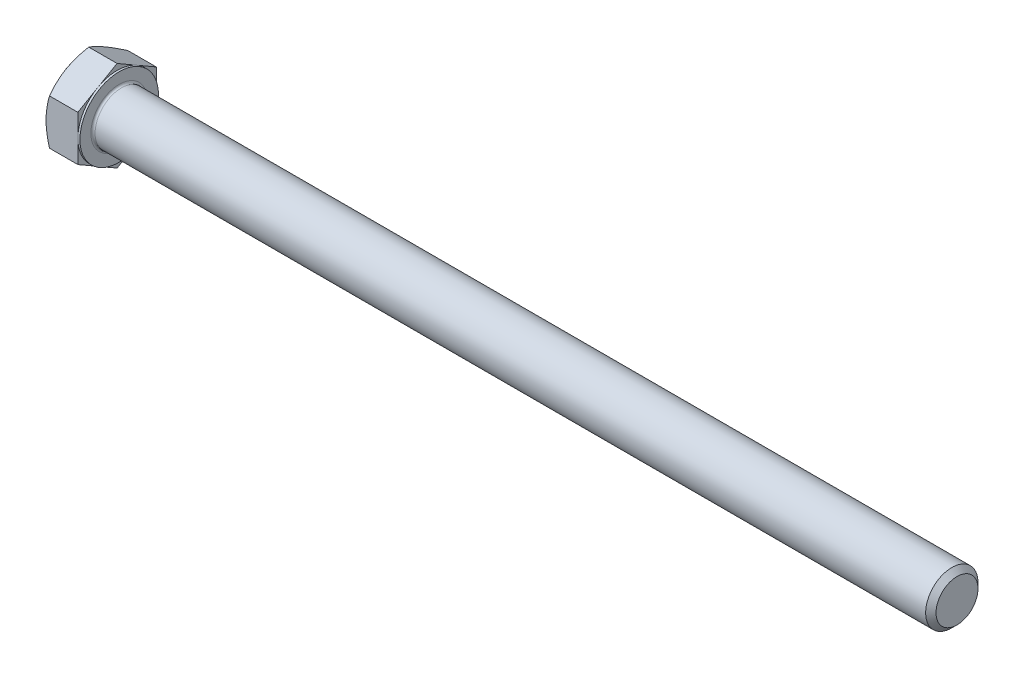
ISO-10303-21;
HEADER;
FILE_DESCRIPTION(('STEP AP214'),'2;1');
FILE_NAME('part.step','',(''),(''),'','','');
FILE_SCHEMA(('AUTOMOTIVE_DESIGN { 1 0 10303 214 1 1 1 1 }'));
ENDSEC;
DATA;
#1=APPLICATION_CONTEXT('core data for automotive mechanical design processes');
#2=APPLICATION_PROTOCOL_DEFINITION('international standard','automotive_design',2000,#1);
#3=PRODUCT_CONTEXT('',#1,'mechanical');
#4=PRODUCT('Part','Part','',(#3));
#5=PRODUCT_RELATED_PRODUCT_CATEGORY('part','',(#4));
#6=PRODUCT_DEFINITION_FORMATION('','',#4);
#7=PRODUCT_DEFINITION_CONTEXT('part definition',#1,'design');
#8=PRODUCT_DEFINITION('design','',#6,#7);
#9=PRODUCT_DEFINITION_SHAPE('','',#8);
#10=(LENGTH_UNIT() NAMED_UNIT(*) SI_UNIT(.MILLI.,.METRE.));
#11=(NAMED_UNIT(*) PLANE_ANGLE_UNIT() SI_UNIT($,.RADIAN.));
#12=(NAMED_UNIT(*) SI_UNIT($,.STERADIAN.) SOLID_ANGLE_UNIT());
#13=UNCERTAINTY_MEASURE_WITH_UNIT(LENGTH_MEASURE(1.E-05),#10,'distance_accuracy_value','');
#14=(GEOMETRIC_REPRESENTATION_CONTEXT(3) GLOBAL_UNCERTAINTY_ASSIGNED_CONTEXT((#13)) GLOBAL_UNIT_ASSIGNED_CONTEXT((#10,
#11,#12)) REPRESENTATION_CONTEXT('',''));
#15=CARTESIAN_POINT('',(0.,0.,0.));
#16=DIRECTION('',(0.,0.,1.));
#17=DIRECTION('',(1.,0.,0.));
#18=AXIS2_PLACEMENT_3D('',#15,#16,#17);
#19=CARTESIAN_POINT('',(6.5532,0.,0.));
#20=DIRECTION('',(1.,0.,0.));
#21=DIRECTION('',(0.,1.,0.));
#22=AXIS2_PLACEMENT_3D('',#19,#20,#21);
#23=TOROIDAL_SURFACE('',#22,5.1435,0.381);
#24=CARTESIAN_POINT('',(6.5532,0.,0.));
#25=DIRECTION('',(1.,0.,0.));
#26=DIRECTION('',(0.,1.,0.));
#27=AXIS2_PLACEMENT_3D('',#24,#25,#26);
#28=CIRCLE('',#27,4.7625);
#29=CARTESIAN_POINT('',(6.5532,4.7625,0.));
#30=VERTEX_POINT('',#29);
#31=EDGE_CURVE('E304',#30,#30,#28,.T.);
#32=ORIENTED_EDGE('',*,*,#31,.F.);
#33=EDGE_LOOP('',(#32));
#34=FACE_BOUND('',#33,.T.);
#35=CARTESIAN_POINT('',(6.1722,0.,0.));
#36=DIRECTION('',(-1.,0.,0.));
#37=DIRECTION('',(0.,0.,1.));
#38=AXIS2_PLACEMENT_3D('',#35,#36,#37);
#39=CIRCLE('',#38,5.1435);
#40=CARTESIAN_POINT('',(6.1722,0.,5.1435));
#41=VERTEX_POINT('',#40);
#42=EDGE_CURVE('E307',#41,#41,#39,.T.);
#43=ORIENTED_EDGE('',*,*,#42,.F.);
#44=EDGE_LOOP('',(#43));
#45=FACE_BOUND('',#44,.T.);
#46=ADVANCED_FACE('F16',(#34,#45),#23,.F.);
#47=CARTESIAN_POINT('',(0.,0.,0.));
#48=DIRECTION('',(-1.,0.,0.));
#49=DIRECTION('',(0.,0.,1.));
#50=AXIS2_PLACEMENT_3D('',#47,#48,#49);
#51=CYLINDRICAL_SURFACE('',#50,7.1374);
#52=CARTESIAN_POINT('',(6.1722,0.,0.));
#53=DIRECTION('',(1.,0.,0.));
#54=DIRECTION('',(0.,1.,0.));
#55=AXIS2_PLACEMENT_3D('',#52,#53,#54);
#56=CIRCLE('',#55,7.1374);
#57=CARTESIAN_POINT('',(6.1722,7.1374,0.));
#58=VERTEX_POINT('',#57);
#59=EDGE_CURVE('E471',#58,#58,#56,.T.);
#60=ORIENTED_EDGE('',*,*,#59,.F.);
#61=EDGE_LOOP('',(#60));
#62=FACE_BOUND('',#61,.T.);
#63=CARTESIAN_POINT('',(5.7912,0.,0.));
#64=DIRECTION('',(-1.,0.,0.));
#65=DIRECTION('',(0.,0.,1.));
#66=AXIS2_PLACEMENT_3D('',#63,#64,#65);
#67=CIRCLE('',#66,7.1374);
#68=CARTESIAN_POINT('',(5.7912,-6.18116971697105,3.5687));
#69=VERTEX_POINT('',#68);
#70=CARTESIAN_POINT('',(5.7912,0.,7.1374));
#71=VERTEX_POINT('',#70);
#72=EDGE_CURVE('E280',#69,#71,#67,.T.);
#73=ORIENTED_EDGE('',*,*,#72,.F.);
#74=CARTESIAN_POINT('',(5.7912,0.,0.));
#75=DIRECTION('',(-1.,0.,0.));
#76=DIRECTION('',(0.,0.,1.));
#77=AXIS2_PLACEMENT_3D('',#74,#75,#76);
#78=CIRCLE('',#77,7.1374);
#79=CARTESIAN_POINT('',(5.7912,-6.18116971697105,-3.56870000000001));
#80=VERTEX_POINT('',#79);
#81=EDGE_CURVE('E35',#80,#69,#78,.T.);
#82=ORIENTED_EDGE('',*,*,#81,.F.);
#83=CARTESIAN_POINT('',(5.7912,0.,0.));
#84=DIRECTION('',(-1.,0.,0.));
#85=DIRECTION('',(0.,0.,1.));
#86=AXIS2_PLACEMENT_3D('',#83,#84,#85);
#87=CIRCLE('',#86,7.1374);
#88=CARTESIAN_POINT('',(5.7912,0.,-7.1374));
#89=VERTEX_POINT('',#88);
#90=EDGE_CURVE('E178',#89,#80,#87,.T.);
#91=ORIENTED_EDGE('',*,*,#90,.F.);
#92=CARTESIAN_POINT('',(5.7912,0.,0.));
#93=DIRECTION('',(-1.,0.,0.));
#94=DIRECTION('',(0.,0.,1.));
#95=AXIS2_PLACEMENT_3D('',#92,#93,#94);
#96=CIRCLE('',#95,7.1374);
#97=CARTESIAN_POINT('',(5.7912,6.18116971697105,-3.56870000000001));
#98=VERTEX_POINT('',#97);
#99=EDGE_CURVE('E290',#98,#89,#96,.T.);
#100=ORIENTED_EDGE('',*,*,#99,.F.);
#101=CARTESIAN_POINT('',(5.7912,0.,0.));
#102=DIRECTION('',(-1.,0.,0.));
#103=DIRECTION('',(0.,0.,1.));
#104=AXIS2_PLACEMENT_3D('',#101,#102,#103);
#105=CIRCLE('',#104,7.1374);
#106=CARTESIAN_POINT('',(5.7912,6.18116971697105,3.56870000000001));
#107=VERTEX_POINT('',#106);
#108=EDGE_CURVE('E295',#107,#98,#105,.T.);
#109=ORIENTED_EDGE('',*,*,#108,.F.);
#110=CARTESIAN_POINT('',(5.7912,0.,0.));
#111=DIRECTION('',(-1.,0.,0.));
#112=DIRECTION('',(0.,0.,1.));
#113=AXIS2_PLACEMENT_3D('',#110,#111,#112);
#114=CIRCLE('',#113,7.1374);
#115=EDGE_CURVE('E298',#71,#107,#114,.T.);
#116=ORIENTED_EDGE('',*,*,#115,.F.);
#117=EDGE_LOOP('',(#73,#82,#91,#100,#109,#116));
#118=FACE_BOUND('',#117,.T.);
#119=ADVANCED_FACE('F338',(#62,#118),#51,.T.);
#120=CARTESIAN_POINT('',(136.98855,0.,0.));
#121=DIRECTION('',(-1.,0.,0.));
#122=DIRECTION('',(0.,0.,1.));
#123=AXIS2_PLACEMENT_3D('',#120,#121,#122);
#124=CONICAL_SURFACE('',#123,25.4,0.785398163397445);
#125=CARTESIAN_POINT('',(158.5722,0.,0.));
#126=DIRECTION('',(-1.,0.,0.));
#127=DIRECTION('',(0.,0.,1.));
#128=AXIS2_PLACEMENT_3D('',#125,#126,#127);
#129=CIRCLE('',#128,3.81635);
#130=CARTESIAN_POINT('',(158.5722,0.,3.81635));
#131=VERTEX_POINT('',#130);
#132=EDGE_CURVE('E11',#131,#131,#129,.T.);
#133=ORIENTED_EDGE('',*,*,#132,.T.);
#134=EDGE_LOOP('',(#133));
#135=FACE_BOUND('',#134,.T.);
#136=CARTESIAN_POINT('',(157.62605,0.,0.));
#137=DIRECTION('',(-1.,0.,0.));
#138=DIRECTION('',(0.,0.,1.));
#139=AXIS2_PLACEMENT_3D('',#136,#137,#138);
#140=CIRCLE('',#139,4.7625);
#141=CARTESIAN_POINT('',(157.62605,0.,4.7625));
#142=VERTEX_POINT('',#141);
#143=EDGE_CURVE('E26',#142,#142,#140,.T.);
#144=ORIENTED_EDGE('',*,*,#143,.F.);
#145=EDGE_LOOP('',(#144));
#146=FACE_BOUND('',#145,.T.);
#147=ADVANCED_FACE('F344',(#135,#146),#124,.T.);
#148=CARTESIAN_POINT('',(0.,0.,0.));
#149=DIRECTION('',(-1.,0.,0.));
#150=DIRECTION('',(0.,0.,1.));
#151=AXIS2_PLACEMENT_3D('',#148,#149,#150);
#152=CYLINDRICAL_SURFACE('',#151,4.7625);
#153=ORIENTED_EDGE('',*,*,#143,.T.);
#154=EDGE_LOOP('',(#153));
#155=FACE_BOUND('',#154,.T.);
#156=ORIENTED_EDGE('',*,*,#31,.T.);
#157=EDGE_LOOP('',(#156));
#158=FACE_BOUND('',#157,.T.);
#159=ADVANCED_FACE('F354',(#155,#158),#152,.T.);
#160=CARTESIAN_POINT('',(6.1722,8.24155962262808,0.));
#161=DIRECTION('',(1.,0.,0.));
#162=DIRECTION('',(0.,0.,-1.));
#163=AXIS2_PLACEMENT_3D('',#160,#161,#162);
#164=PLANE('',#163);
#165=ORIENTED_EDGE('',*,*,#59,.T.);
#166=EDGE_LOOP('',(#165));
#167=FACE_BOUND('',#166,.T.);
#168=ORIENTED_EDGE('',*,*,#42,.T.);
#169=EDGE_LOOP('',(#168));
#170=FACE_BOUND('',#169,.T.);
#171=ADVANCED_FACE('F350',(#167,#170),#164,.T.);
#172=CARTESIAN_POINT('',(158.5722,0.,0.));
#173=DIRECTION('',(-1.,0.,0.));
#174=DIRECTION('',(0.,0.,1.));
#175=AXIS2_PLACEMENT_3D('',#172,#173,#174);
#176=PLANE('',#175);
#177=ORIENTED_EDGE('',*,*,#132,.F.);
#178=EDGE_LOOP('',(#177));
#179=FACE_BOUND('',#178,.T.);
#180=ADVANCED_FACE('F353',(#179),#176,.F.);
#181=CARTESIAN_POINT('',(5.7912,7.1374,0.));
#182=DIRECTION('',(1.,0.,0.));
#183=DIRECTION('',(0.,0.,-1.));
#184=AXIS2_PLACEMENT_3D('',#181,#182,#183);
#185=PLANE('',#184);
#186=DIRECTION('',(0.,0.500000000000001,0.866025403784438));
#187=VECTOR('',#186,1.);
#188=CARTESIAN_POINT('',(5.7912,4.12077981131404,-7.1374));
#189=LINE('',#188,#187);
#190=CARTESIAN_POINT('',(5.7912,4.12077981131404,-7.1374));
#191=VERTEX_POINT('',#190);
#192=EDGE_CURVE('E293',#191,#98,#189,.T.);
#193=ORIENTED_EDGE('',*,*,#192,.T.);
#194=ORIENTED_EDGE('',*,*,#99,.T.);
#195=DIRECTION('',(0.,1.,0.));
#196=VECTOR('',#195,1.);
#197=CARTESIAN_POINT('',(5.7912,0.,-7.1374));
#198=LINE('',#197,#196);
#199=EDGE_CURVE('E294',#89,#191,#198,.T.);
#200=ORIENTED_EDGE('',*,*,#199,.T.);
#201=EDGE_LOOP('',(#193,#194,#200));
#202=FACE_BOUND('',#201,.T.);
#203=ADVANCED_FACE('F358',(#202),#185,.T.);
#204=CARTESIAN_POINT('',(5.7912,7.1374,0.));
#205=DIRECTION('',(1.,0.,0.));
#206=DIRECTION('',(0.,0.,-1.));
#207=AXIS2_PLACEMENT_3D('',#204,#205,#206);
#208=PLANE('',#207);
#209=DIRECTION('',(0.,0.500000000000001,0.866025403784438));
#210=VECTOR('',#209,1.);
#211=CARTESIAN_POINT('',(5.7912,6.18116971697106,-3.56870000000001));
#212=LINE('',#211,#210);
#213=CARTESIAN_POINT('',(5.7912,8.24155962262808,0.));
#214=VERTEX_POINT('',#213);
#215=EDGE_CURVE('E166',#98,#214,#212,.T.);
#216=ORIENTED_EDGE('',*,*,#215,.T.);
#217=DIRECTION('',(0.,-0.500000000000001,0.866025403784438));
#218=VECTOR('',#217,1.);
#219=CARTESIAN_POINT('',(5.7912,8.24155962262808,0.));
#220=LINE('',#219,#218);
#221=EDGE_CURVE('E160',#214,#107,#220,.T.);
#222=ORIENTED_EDGE('',*,*,#221,.T.);
#223=ORIENTED_EDGE('',*,*,#108,.T.);
#224=EDGE_LOOP('',(#216,#222,#223));
#225=FACE_BOUND('',#224,.T.);
#226=ADVANCED_FACE('F362',(#225),#208,.T.);
#227=CARTESIAN_POINT('',(5.7912,7.1374,0.));
#228=DIRECTION('',(1.,0.,0.));
#229=DIRECTION('',(0.,0.,-1.));
#230=AXIS2_PLACEMENT_3D('',#227,#228,#229);
#231=PLANE('',#230);
#232=DIRECTION('',(0.,-0.500000000000001,0.866025403784438));
#233=VECTOR('',#232,1.);
#234=CARTESIAN_POINT('',(5.7912,6.18116971697105,3.56870000000001));
#235=LINE('',#234,#233);
#236=CARTESIAN_POINT('',(5.7912,4.12077981131403,7.1374));
#237=VERTEX_POINT('',#236);
#238=EDGE_CURVE('E297',#107,#237,#235,.T.);
#239=ORIENTED_EDGE('',*,*,#238,.T.);
#240=DIRECTION('',(0.,-1.,0.));
#241=VECTOR('',#240,1.);
#242=CARTESIAN_POINT('',(5.7912,4.12077981131403,7.1374));
#243=LINE('',#242,#241);
#244=EDGE_CURVE('E299',#237,#71,#243,.T.);
#245=ORIENTED_EDGE('',*,*,#244,.T.);
#246=ORIENTED_EDGE('',*,*,#115,.T.);
#247=EDGE_LOOP('',(#239,#245,#246));
#248=FACE_BOUND('',#247,.T.);
#249=ADVANCED_FACE('F366',(#248),#231,.T.);
#250=CARTESIAN_POINT('',(5.7912,7.1374,0.));
#251=DIRECTION('',(1.,0.,0.));
#252=DIRECTION('',(0.,0.,-1.));
#253=AXIS2_PLACEMENT_3D('',#250,#251,#252);
#254=PLANE('',#253);
#255=DIRECTION('',(0.,-1.,0.));
#256=VECTOR('',#255,1.);
#257=CARTESIAN_POINT('',(5.7912,0.,7.1374));
#258=LINE('',#257,#256);
#259=CARTESIAN_POINT('',(5.7912,-4.12077981131405,7.1374));
#260=VERTEX_POINT('',#259);
#261=EDGE_CURVE('E300',#71,#260,#258,.T.);
#262=ORIENTED_EDGE('',*,*,#261,.T.);
#263=DIRECTION('',(0.,-0.500000000000001,-0.866025403784438));
#264=VECTOR('',#263,1.);
#265=CARTESIAN_POINT('',(5.7912,-4.12077981131405,7.1374));
#266=LINE('',#265,#264);
#267=EDGE_CURVE('E282',#260,#69,#266,.T.);
#268=ORIENTED_EDGE('',*,*,#267,.T.);
#269=ORIENTED_EDGE('',*,*,#72,.T.);
#270=EDGE_LOOP('',(#262,#268,#269));
#271=FACE_BOUND('',#270,.T.);
#272=ADVANCED_FACE('F319',(#271),#254,.T.);
#273=CARTESIAN_POINT('',(5.7912,7.1374,0.));
#274=DIRECTION('',(1.,0.,0.));
#275=DIRECTION('',(0.,0.,-1.));
#276=AXIS2_PLACEMENT_3D('',#273,#274,#275);
#277=PLANE('',#276);
#278=DIRECTION('',(0.,-0.500000000000001,-0.866025403784438));
#279=VECTOR('',#278,1.);
#280=CARTESIAN_POINT('',(5.7912,-6.18116971697107,3.56870000000001));
#281=LINE('',#280,#279);
#282=CARTESIAN_POINT('',(5.7912,-8.2415596226281,0.));
#283=VERTEX_POINT('',#282);
#284=EDGE_CURVE('E277',#69,#283,#281,.T.);
#285=ORIENTED_EDGE('',*,*,#284,.T.);
#286=DIRECTION('',(0.,0.500000000000001,-0.866025403784438));
#287=VECTOR('',#286,1.);
#288=CARTESIAN_POINT('',(5.7912,-8.2415596226281,0.));
#289=LINE('',#288,#287);
#290=EDGE_CURVE('E275',#283,#80,#289,.T.);
#291=ORIENTED_EDGE('',*,*,#290,.T.);
#292=ORIENTED_EDGE('',*,*,#81,.T.);
#293=EDGE_LOOP('',(#285,#291,#292));
#294=FACE_BOUND('',#293,.T.);
#295=ADVANCED_FACE('F279',(#294),#277,.T.);
#296=CARTESIAN_POINT('',(5.7912,7.1374,0.));
#297=DIRECTION('',(1.,0.,0.));
#298=DIRECTION('',(0.,0.,-1.));
#299=AXIS2_PLACEMENT_3D('',#296,#297,#298);
#300=PLANE('',#299);
#301=DIRECTION('',(0.,0.500000000000001,-0.866025403784438));
#302=VECTOR('',#301,1.);
#303=CARTESIAN_POINT('',(5.7912,-6.18116971697106,-3.56870000000002));
#304=LINE('',#303,#302);
#305=CARTESIAN_POINT('',(5.7912,-4.12077981131404,-7.1374));
#306=VERTEX_POINT('',#305);
#307=EDGE_CURVE('E276',#80,#306,#304,.T.);
#308=ORIENTED_EDGE('',*,*,#307,.T.);
#309=DIRECTION('',(0.,1.,0.));
#310=VECTOR('',#309,1.);
#311=CARTESIAN_POINT('',(5.7912,-4.12077981131404,-7.1374));
#312=LINE('',#311,#310);
#313=EDGE_CURVE('E132',#306,#89,#312,.T.);
#314=ORIENTED_EDGE('',*,*,#313,.T.);
#315=ORIENTED_EDGE('',*,*,#90,.T.);
#316=EDGE_LOOP('',(#308,#314,#315));
#317=FACE_BOUND('',#316,.T.);
#318=ADVANCED_FACE('F327',(#317),#300,.T.);
#319=CARTESIAN_POINT('',(0.,8.24155962262808,0.));
#320=DIRECTION('',(1.,0.,0.));
#321=DIRECTION('',(0.,0.,-1.));
#322=AXIS2_PLACEMENT_3D('',#319,#320,#321);
#323=PLANE('',#322);
#324=CARTESIAN_POINT('',(0.,0.,0.));
#325=DIRECTION('',(1.,0.,0.));
#326=DIRECTION('',(0.,1.,0.));
#327=AXIS2_PLACEMENT_3D('',#324,#325,#326);
#328=CIRCLE('',#327,7.1374);
#329=CARTESIAN_POINT('',(0.,0.,-7.1374));
#330=VERTEX_POINT('',#329);
#331=CARTESIAN_POINT('',(0.,6.18116971697105,-3.56870000000001));
#332=VERTEX_POINT('',#331);
#333=EDGE_CURVE('E127',#330,#332,#328,.T.);
#334=ORIENTED_EDGE('',*,*,#333,.F.);
#335=CARTESIAN_POINT('',(0.,0.,0.));
#336=DIRECTION('',(1.,0.,0.));
#337=DIRECTION('',(0.,1.,0.));
#338=AXIS2_PLACEMENT_3D('',#335,#336,#337);
#339=CIRCLE('',#338,7.1374);
#340=CARTESIAN_POINT('',(0.,-6.18116971697105,-3.56870000000001));
#341=VERTEX_POINT('',#340);
#342=EDGE_CURVE('E114',#341,#330,#339,.T.);
#343=ORIENTED_EDGE('',*,*,#342,.F.);
#344=CARTESIAN_POINT('',(0.,0.,0.));
#345=DIRECTION('',(1.,0.,0.));
#346=DIRECTION('',(0.,1.,0.));
#347=AXIS2_PLACEMENT_3D('',#344,#345,#346);
#348=CIRCLE('',#347,7.1374);
#349=CARTESIAN_POINT('',(0.,-6.18116971697105,3.5687));
#350=VERTEX_POINT('',#349);
#351=EDGE_CURVE('E229',#350,#341,#348,.T.);
#352=ORIENTED_EDGE('',*,*,#351,.F.);
#353=CARTESIAN_POINT('',(0.,0.,0.));
#354=DIRECTION('',(1.,0.,0.));
#355=DIRECTION('',(0.,1.,0.));
#356=AXIS2_PLACEMENT_3D('',#353,#354,#355);
#357=CIRCLE('',#356,7.1374);
#358=CARTESIAN_POINT('',(0.,0.,7.1374));
#359=VERTEX_POINT('',#358);
#360=EDGE_CURVE('E213',#359,#350,#357,.T.);
#361=ORIENTED_EDGE('',*,*,#360,.F.);
#362=CARTESIAN_POINT('',(0.,0.,0.));
#363=DIRECTION('',(-1.,0.,0.));
#364=DIRECTION('',(0.,0.,1.));
#365=AXIS2_PLACEMENT_3D('',#362,#363,#364);
#366=CIRCLE('',#365,7.1374);
#367=CARTESIAN_POINT('',(0.,6.18116971697105,3.56870000000001));
#368=VERTEX_POINT('',#367);
#369=EDGE_CURVE('E176',#359,#368,#366,.T.);
#370=ORIENTED_EDGE('',*,*,#369,.T.);
#371=CARTESIAN_POINT('',(0.,0.,0.));
#372=DIRECTION('',(1.,0.,0.));
#373=DIRECTION('',(0.,1.,0.));
#374=AXIS2_PLACEMENT_3D('',#371,#372,#373);
#375=CIRCLE('',#374,7.1374);
#376=EDGE_CURVE('E172',#332,#368,#375,.T.);
#377=ORIENTED_EDGE('',*,*,#376,.F.);
#378=EDGE_LOOP('',(#334,#343,#352,#361,#370,#377));
#379=FACE_BOUND('',#378,.T.);
#380=ADVANCED_FACE('F325',(#379),#323,.F.);
#381=CARTESIAN_POINT('',(10.5439170261023,0.,0.));
#382=DIRECTION('',(1.,0.,0.));
#383=DIRECTION('',(0.,1.,0.));
#384=AXIS2_PLACEMENT_3D('',#381,#382,#383);
#385=CONICAL_SURFACE('',#384,25.4,1.0471975511966);
#386=CARTESIAN_POINT('',(6.7912,-2.56913644120969,18.7246748477518));
#387=CARTESIAN_POINT('',(-2.56461616851412,6.18116971697105,3.56870000000001));
#388=CARTESIAN_POINT('',(6.7912,14.9314758751518,-11.5872748477518));
#389=(BOUNDED_CURVE() B_SPLINE_CURVE(2,(#386,#387,#388),.UNSPECIFIED.,.F.,
.F.) B_SPLINE_CURVE_WITH_KNOTS((3,3),(0.,3.75442048197898),
.UNSPECIFIED.) CURVE() GEOMETRIC_REPRESENTATION_ITEM() RATIONAL_B_SPLINE_CURVE((1.,
2.64803758292402,1.)) REPRESENTATION_ITEM(''));
#390=CARTESIAN_POINT('',(0.637486855352628,8.24155962262808,0.));
#391=VERTEX_POINT('',#390);
#392=EDGE_CURVE('E156',#368,#391,#389,.T.);
#393=ORIENTED_EDGE('',*,*,#392,.T.);
#394=CARTESIAN_POINT('',(6.7912,14.9314758751518,11.5872748477518));
#395=CARTESIAN_POINT('',(-2.56461616851412,6.18116971697106,-3.56870000000001));
#396=CARTESIAN_POINT('',(6.7912,-2.56913644120967,-18.7246748477518));
#397=(BOUNDED_CURVE() B_SPLINE_CURVE(2,(#394,#395,#396),.UNSPECIFIED.,.F.,
.F.) B_SPLINE_CURVE_WITH_KNOTS((3,3),(0.,3.75442048197898),
.UNSPECIFIED.) CURVE() GEOMETRIC_REPRESENTATION_ITEM() RATIONAL_B_SPLINE_CURVE((1.,
2.64803758292402,1.)) REPRESENTATION_ITEM(''));
#398=EDGE_CURVE('E169',#391,#332,#397,.T.);
#399=ORIENTED_EDGE('',*,*,#398,.T.);
#400=ORIENTED_EDGE('',*,*,#376,.T.);
#401=EDGE_LOOP('',(#393,#399,#400));
#402=FACE_BOUND('',#401,.T.);
#403=ADVANCED_FACE('F174',(#402),#385,.T.);
#404=CARTESIAN_POINT('',(10.5439170261023,0.,0.));
#405=DIRECTION('',(1.,0.,0.));
#406=DIRECTION('',(0.,1.,0.));
#407=AXIS2_PLACEMENT_3D('',#404,#405,#406);
#408=CONICAL_SURFACE('',#407,25.4,1.0471975511966);
#409=CARTESIAN_POINT('',(6.7912,-17.5006123163614,7.1374));
#410=CARTESIAN_POINT('',(-2.56461616851412,0.,7.1374));
#411=CARTESIAN_POINT('',(6.7912,17.5006123163614,7.1374));
#412=(BOUNDED_CURVE() B_SPLINE_CURVE(2,(#409,#410,#411),.UNSPECIFIED.,.F.,
.F.) B_SPLINE_CURVE_WITH_KNOTS((3,3),(0.,3.75442048197898),
.UNSPECIFIED.) CURVE() GEOMETRIC_REPRESENTATION_ITEM() RATIONAL_B_SPLINE_CURVE((1.,
2.64803758292402,1.)) REPRESENTATION_ITEM(''));
#413=CARTESIAN_POINT('',(0.637486855352622,4.12077981131403,7.1374));
#414=VERTEX_POINT('',#413);
#415=EDGE_CURVE('E189',#359,#414,#412,.T.);
#416=ORIENTED_EDGE('',*,*,#415,.T.);
#417=CARTESIAN_POINT('',(6.7912,-2.56913644120969,18.7246748477518));
#418=CARTESIAN_POINT('',(-2.56461616851412,6.18116971697105,3.56870000000001));
#419=CARTESIAN_POINT('',(6.7912,14.9314758751518,-11.5872748477518));
#420=(BOUNDED_CURVE() B_SPLINE_CURVE(2,(#417,#418,#419),.UNSPECIFIED.,.F.,
.F.) B_SPLINE_CURVE_WITH_KNOTS((3,3),(0.,3.75442048197898),
.UNSPECIFIED.) CURVE() GEOMETRIC_REPRESENTATION_ITEM() RATIONAL_B_SPLINE_CURVE((1.,
2.64803758292402,1.)) REPRESENTATION_ITEM(''));
#421=EDGE_CURVE('E197',#414,#368,#420,.T.);
#422=ORIENTED_EDGE('',*,*,#421,.T.);
#423=ORIENTED_EDGE('',*,*,#369,.F.);
#424=EDGE_LOOP('',(#416,#422,#423));
#425=FACE_BOUND('',#424,.T.);
#426=ADVANCED_FACE('F324',(#425),#408,.T.);
#427=CARTESIAN_POINT('',(10.5439170261023,0.,0.));
#428=DIRECTION('',(1.,0.,0.));
#429=DIRECTION('',(0.,1.,0.));
#430=AXIS2_PLACEMENT_3D('',#427,#428,#429);
#431=CONICAL_SURFACE('',#430,25.4,1.0471975511966);
#432=CARTESIAN_POINT('',(6.7912,-17.5006123163614,7.1374));
#433=CARTESIAN_POINT('',(-2.56461616851412,0.,7.1374));
#434=CARTESIAN_POINT('',(6.7912,17.5006123163614,7.1374));
#435=(BOUNDED_CURVE() B_SPLINE_CURVE(2,(#432,#433,#434),.UNSPECIFIED.,.F.,
.F.) B_SPLINE_CURVE_WITH_KNOTS((3,3),(0.,3.75442048197898),
.UNSPECIFIED.) CURVE() GEOMETRIC_REPRESENTATION_ITEM() RATIONAL_B_SPLINE_CURVE((1.,
2.64803758292402,1.)) REPRESENTATION_ITEM(''));
#436=CARTESIAN_POINT('',(0.637486855352629,-4.12077981131405,7.1374));
#437=VERTEX_POINT('',#436);
#438=EDGE_CURVE('E205',#437,#359,#435,.T.);
#439=ORIENTED_EDGE('',*,*,#438,.T.);
#440=ORIENTED_EDGE('',*,*,#360,.T.);
#441=CARTESIAN_POINT('',(6.7912,-14.9314758751518,-11.5872748477518));
#442=CARTESIAN_POINT('',(-2.56461616851411,-6.18116971697107,3.56870000000002));
#443=CARTESIAN_POINT('',(6.7912,2.56913644120966,18.7246748477518));
#444=(BOUNDED_CURVE() B_SPLINE_CURVE(2,(#441,#442,#443),.UNSPECIFIED.,.F.,
.F.) B_SPLINE_CURVE_WITH_KNOTS((3,3),(0.,3.75442048197897),
.UNSPECIFIED.) CURVE() GEOMETRIC_REPRESENTATION_ITEM() RATIONAL_B_SPLINE_CURVE((1.,
2.64803758292402,1.)) REPRESENTATION_ITEM(''));
#445=EDGE_CURVE('E214',#350,#437,#444,.T.);
#446=ORIENTED_EDGE('',*,*,#445,.T.);
#447=EDGE_LOOP('',(#439,#440,#446));
#448=FACE_BOUND('',#447,.T.);
#449=ADVANCED_FACE('F264',(#448),#431,.T.);
#450=CARTESIAN_POINT('',(10.5439170261023,0.,0.));
#451=DIRECTION('',(1.,0.,0.));
#452=DIRECTION('',(0.,1.,0.));
#453=AXIS2_PLACEMENT_3D('',#450,#451,#452);
#454=CONICAL_SURFACE('',#453,25.4,1.0471975511966);
#455=CARTESIAN_POINT('',(6.7912,-14.9314758751518,-11.5872748477518));
#456=CARTESIAN_POINT('',(-2.56461616851411,-6.18116971697107,3.56870000000002));
#457=CARTESIAN_POINT('',(6.7912,2.56913644120966,18.7246748477518));
#458=(BOUNDED_CURVE() B_SPLINE_CURVE(2,(#455,#456,#457),.UNSPECIFIED.,.F.,
.F.) B_SPLINE_CURVE_WITH_KNOTS((3,3),(0.,3.75442048197897),
.UNSPECIFIED.) CURVE() GEOMETRIC_REPRESENTATION_ITEM() RATIONAL_B_SPLINE_CURVE((1.,
2.64803758292402,1.)) REPRESENTATION_ITEM(''));
#459=CARTESIAN_POINT('',(0.637486855352637,-8.2415596226281,0.));
#460=VERTEX_POINT('',#459);
#461=EDGE_CURVE('E221',#460,#350,#458,.T.);
#462=ORIENTED_EDGE('',*,*,#461,.T.);
#463=ORIENTED_EDGE('',*,*,#351,.T.);
#464=CARTESIAN_POINT('',(6.7912,2.56913644120967,-18.7246748477518));
#465=CARTESIAN_POINT('',(-2.56461616851411,-6.18116971697106,-3.56870000000002));
#466=CARTESIAN_POINT('',(6.7912,-14.9314758751518,11.5872748477518));
#467=(BOUNDED_CURVE() B_SPLINE_CURVE(2,(#464,#465,#466),.UNSPECIFIED.,.F.,
.F.) B_SPLINE_CURVE_WITH_KNOTS((3,3),(0.,3.75442048197897),
.UNSPECIFIED.) CURVE() GEOMETRIC_REPRESENTATION_ITEM() RATIONAL_B_SPLINE_CURVE((1.,
2.64803758292402,1.)) REPRESENTATION_ITEM(''));
#468=EDGE_CURVE('E125',#341,#460,#467,.T.);
#469=ORIENTED_EDGE('',*,*,#468,.T.);
#470=EDGE_LOOP('',(#462,#463,#469));
#471=FACE_BOUND('',#470,.T.);
#472=ADVANCED_FACE('F270',(#471),#454,.T.);
#473=CARTESIAN_POINT('',(10.5439170261023,0.,0.));
#474=DIRECTION('',(1.,0.,0.));
#475=DIRECTION('',(0.,1.,0.));
#476=AXIS2_PLACEMENT_3D('',#473,#474,#475);
#477=CONICAL_SURFACE('',#476,25.4,1.0471975511966);
#478=CARTESIAN_POINT('',(6.7912,14.9314758751518,11.5872748477518));
#479=CARTESIAN_POINT('',(-2.56461616851412,6.18116971697106,-3.56870000000001));
#480=CARTESIAN_POINT('',(6.7912,-2.56913644120967,-18.7246748477518));
#481=(BOUNDED_CURVE() B_SPLINE_CURVE(2,(#478,#479,#480),.UNSPECIFIED.,.F.,
.F.) B_SPLINE_CURVE_WITH_KNOTS((3,3),(0.,3.75442048197898),
.UNSPECIFIED.) CURVE() GEOMETRIC_REPRESENTATION_ITEM() RATIONAL_B_SPLINE_CURVE((1.,
2.64803758292402,1.)) REPRESENTATION_ITEM(''));
#482=CARTESIAN_POINT('',(0.637486855352623,4.12077981131404,-7.1374));
#483=VERTEX_POINT('',#482);
#484=EDGE_CURVE('E170',#332,#483,#481,.T.);
#485=ORIENTED_EDGE('',*,*,#484,.T.);
#486=CARTESIAN_POINT('',(6.7912,17.5006123163614,-7.1374));
#487=CARTESIAN_POINT('',(-2.56461616851412,0.,-7.1374));
#488=CARTESIAN_POINT('',(6.7912,-17.5006123163614,-7.1374));
#489=(BOUNDED_CURVE() B_SPLINE_CURVE(2,(#486,#487,#488),.UNSPECIFIED.,.F.,
.F.) B_SPLINE_CURVE_WITH_KNOTS((3,3),(0.,3.75442048197898),
.UNSPECIFIED.) CURVE() GEOMETRIC_REPRESENTATION_ITEM() RATIONAL_B_SPLINE_CURVE((1.,
2.64803758292402,1.)) REPRESENTATION_ITEM(''));
#490=EDGE_CURVE('E105',#483,#330,#489,.T.);
#491=ORIENTED_EDGE('',*,*,#490,.T.);
#492=ORIENTED_EDGE('',*,*,#333,.T.);
#493=EDGE_LOOP('',(#485,#491,#492));
#494=FACE_BOUND('',#493,.T.);
#495=ADVANCED_FACE('F18',(#494),#477,.T.);
#496=CARTESIAN_POINT('',(10.5439170261023,0.,0.));
#497=DIRECTION('',(1.,0.,0.));
#498=DIRECTION('',(0.,1.,0.));
#499=AXIS2_PLACEMENT_3D('',#496,#497,#498);
#500=CONICAL_SURFACE('',#499,25.4,1.0471975511966);
#501=CARTESIAN_POINT('',(6.7912,2.56913644120967,-18.7246748477518));
#502=CARTESIAN_POINT('',(-2.56461616851411,-6.18116971697106,-3.56870000000002));
#503=CARTESIAN_POINT('',(6.7912,-14.9314758751518,11.5872748477518));
#504=(BOUNDED_CURVE() B_SPLINE_CURVE(2,(#501,#502,#503),.UNSPECIFIED.,.F.,
.F.) B_SPLINE_CURVE_WITH_KNOTS((3,3),(0.,3.75442048197897),
.UNSPECIFIED.) CURVE() GEOMETRIC_REPRESENTATION_ITEM() RATIONAL_B_SPLINE_CURVE((1.,
2.64803758292402,1.)) REPRESENTATION_ITEM(''));
#505=CARTESIAN_POINT('',(0.637486855352626,-4.12077981131404,-7.1374));
#506=VERTEX_POINT('',#505);
#507=EDGE_CURVE('E113',#506,#341,#504,.T.);
#508=ORIENTED_EDGE('',*,*,#507,.T.);
#509=ORIENTED_EDGE('',*,*,#342,.T.);
#510=CARTESIAN_POINT('',(6.7912,17.5006123163614,-7.1374));
#511=CARTESIAN_POINT('',(-2.56461616851412,0.,-7.1374));
#512=CARTESIAN_POINT('',(6.7912,-17.5006123163614,-7.1374));
#513=(BOUNDED_CURVE() B_SPLINE_CURVE(2,(#510,#511,#512),.UNSPECIFIED.,.F.,
.F.) B_SPLINE_CURVE_WITH_KNOTS((3,3),(0.,3.75442048197898),
.UNSPECIFIED.) CURVE() GEOMETRIC_REPRESENTATION_ITEM() RATIONAL_B_SPLINE_CURVE((1.,
2.64803758292402,1.)) REPRESENTATION_ITEM(''));
#514=EDGE_CURVE('E110',#330,#506,#513,.T.);
#515=ORIENTED_EDGE('',*,*,#514,.T.);
#516=EDGE_LOOP('',(#508,#509,#515));
#517=FACE_BOUND('',#516,.T.);
#518=ADVANCED_FACE('F112',(#517),#500,.T.);
#519=CARTESIAN_POINT('',(6.1722,4.12077981131404,-7.1374));
#520=DIRECTION('',(0.,0.,1.));
#521=DIRECTION('',(1.,0.,0.));
#522=AXIS2_PLACEMENT_3D('',#519,#520,#521);
#523=PLANE('',#522);
#524=ORIENTED_EDGE('',*,*,#313,.F.);
#525=DIRECTION('',(-1.,0.,0.));
#526=VECTOR('',#525,1.);
#527=CARTESIAN_POINT('',(5.7912,-4.12077981131404,-7.1374));
#528=LINE('',#527,#526);
#529=EDGE_CURVE('E117',#306,#506,#528,.T.);
#530=ORIENTED_EDGE('',*,*,#529,.T.);
#531=ORIENTED_EDGE('',*,*,#514,.F.);
#532=ORIENTED_EDGE('',*,*,#490,.F.);
#533=DIRECTION('',(-1.,0.,0.));
#534=VECTOR('',#533,1.);
#535=CARTESIAN_POINT('',(5.7912,4.12077981131404,-7.1374));
#536=LINE('',#535,#534);
#537=EDGE_CURVE('E141',#191,#483,#536,.T.);
#538=ORIENTED_EDGE('',*,*,#537,.F.);
#539=ORIENTED_EDGE('',*,*,#199,.F.);
#540=EDGE_LOOP('',(#524,#530,#531,#532,#538,#539));
#541=FACE_BOUND('',#540,.T.);
#542=ADVANCED_FACE('F129',(#541),#523,.F.);
#543=CARTESIAN_POINT('',(6.1722,-4.12077981131404,-7.1374));
#544=DIRECTION('',(0.,0.866025403784438,0.500000000000001));
#545=DIRECTION('',(0.,-0.500000000000001,0.866025403784438));
#546=AXIS2_PLACEMENT_3D('',#543,#544,#545);
#547=PLANE('',#546);
#548=ORIENTED_EDGE('',*,*,#290,.F.);
#549=DIRECTION('',(-1.,0.,0.));
#550=VECTOR('',#549,1.);
#551=CARTESIAN_POINT('',(5.7912,-8.2415596226281,0.));
#552=LINE('',#551,#550);
#553=EDGE_CURVE('E134',#283,#460,#552,.T.);
#554=ORIENTED_EDGE('',*,*,#553,.T.);
#555=ORIENTED_EDGE('',*,*,#468,.F.);
#556=ORIENTED_EDGE('',*,*,#507,.F.);
#557=ORIENTED_EDGE('',*,*,#529,.F.);
#558=ORIENTED_EDGE('',*,*,#307,.F.);
#559=EDGE_LOOP('',(#548,#554,#555,#556,#557,#558));
#560=FACE_BOUND('',#559,.T.);
#561=ADVANCED_FACE('F122',(#560),#547,.F.);
#562=CARTESIAN_POINT('',(6.1722,-8.2415596226281,0.));
#563=DIRECTION('',(0.,0.866025403784438,-0.500000000000001));
#564=DIRECTION('',(0.,0.500000000000001,0.866025403784438));
#565=AXIS2_PLACEMENT_3D('',#562,#563,#564);
#566=PLANE('',#565);
#567=ORIENTED_EDGE('',*,*,#267,.F.);
#568=DIRECTION('',(-1.,0.,0.));
#569=VECTOR('',#568,1.);
#570=CARTESIAN_POINT('',(5.7912,-4.12077981131405,7.1374));
#571=LINE('',#570,#569);
#572=EDGE_CURVE('E136',#260,#437,#571,.T.);
#573=ORIENTED_EDGE('',*,*,#572,.T.);
#574=ORIENTED_EDGE('',*,*,#445,.F.);
#575=ORIENTED_EDGE('',*,*,#461,.F.);
#576=ORIENTED_EDGE('',*,*,#553,.F.);
#577=ORIENTED_EDGE('',*,*,#284,.F.);
#578=EDGE_LOOP('',(#567,#573,#574,#575,#576,#577));
#579=FACE_BOUND('',#578,.T.);
#580=ADVANCED_FACE('F273',(#579),#566,.F.);
#581=CARTESIAN_POINT('',(6.1722,4.12077981131403,7.1374));
#582=DIRECTION('',(0.,0.,-1.));
#583=DIRECTION('',(-1.,0.,0.));
#584=AXIS2_PLACEMENT_3D('',#581,#582,#583);
#585=PLANE('',#584);
#586=ORIENTED_EDGE('',*,*,#244,.F.);
#587=DIRECTION('',(-1.,0.,0.));
#588=VECTOR('',#587,1.);
#589=CARTESIAN_POINT('',(5.7912,4.12077981131403,7.1374));
#590=LINE('',#589,#588);
#591=EDGE_CURVE('E145',#237,#414,#590,.T.);
#592=ORIENTED_EDGE('',*,*,#591,.T.);
#593=ORIENTED_EDGE('',*,*,#415,.F.);
#594=ORIENTED_EDGE('',*,*,#438,.F.);
#595=ORIENTED_EDGE('',*,*,#572,.F.);
#596=ORIENTED_EDGE('',*,*,#261,.F.);
#597=EDGE_LOOP('',(#586,#592,#593,#594,#595,#596));
#598=FACE_BOUND('',#597,.T.);
#599=ADVANCED_FACE('F321',(#598),#585,.F.);
#600=CARTESIAN_POINT('',(6.1722,8.24155962262808,0.));
#601=DIRECTION('',(0.,-0.866025403784438,-0.500000000000001));
#602=DIRECTION('',(0.,0.500000000000001,-0.866025403784438));
#603=AXIS2_PLACEMENT_3D('',#600,#601,#602);
#604=PLANE('',#603);
#605=ORIENTED_EDGE('',*,*,#221,.F.);
#606=DIRECTION('',(-1.,0.,0.));
#607=VECTOR('',#606,1.);
#608=CARTESIAN_POINT('',(5.7912,8.24155962262808,0.));
#609=LINE('',#608,#607);
#610=EDGE_CURVE('E20',#214,#391,#609,.T.);
#611=ORIENTED_EDGE('',*,*,#610,.T.);
#612=ORIENTED_EDGE('',*,*,#392,.F.);
#613=ORIENTED_EDGE('',*,*,#421,.F.);
#614=ORIENTED_EDGE('',*,*,#591,.F.);
#615=ORIENTED_EDGE('',*,*,#238,.F.);
#616=EDGE_LOOP('',(#605,#611,#612,#613,#614,#615));
#617=FACE_BOUND('',#616,.T.);
#618=ADVANCED_FACE('F154',(#617),#604,.F.);
#619=CARTESIAN_POINT('',(6.1722,4.12077981131404,-7.1374));
#620=DIRECTION('',(0.,-0.866025403784438,0.500000000000001));
#621=DIRECTION('',(0.,-0.500000000000001,-0.866025403784438));
#622=AXIS2_PLACEMENT_3D('',#619,#620,#621);
#623=PLANE('',#622);
#624=ORIENTED_EDGE('',*,*,#192,.F.);
#625=ORIENTED_EDGE('',*,*,#537,.T.);
#626=ORIENTED_EDGE('',*,*,#484,.F.);
#627=ORIENTED_EDGE('',*,*,#398,.F.);
#628=ORIENTED_EDGE('',*,*,#610,.F.);
#629=ORIENTED_EDGE('',*,*,#215,.F.);
#630=EDGE_LOOP('',(#624,#625,#626,#627,#628,#629));
#631=FACE_BOUND('',#630,.T.);
#632=ADVANCED_FACE('F165',(#631),#623,.F.);
#633=CLOSED_SHELL('',(#46,#119,#147,#159,#171,#180,#203,#226,#249,#272,#295,#318,#380,#403,#426,
#449,#472,#495,#518,#542,#561,#580,#599,#618,#632));
#634=MANIFOLD_SOLID_BREP('B1',#633);
#635=ADVANCED_BREP_SHAPE_REPRESENTATION('',(#18,#634),#14);
#636=SHAPE_DEFINITION_REPRESENTATION(#9,#635);
ENDSEC;
END-ISO-10303-21;
